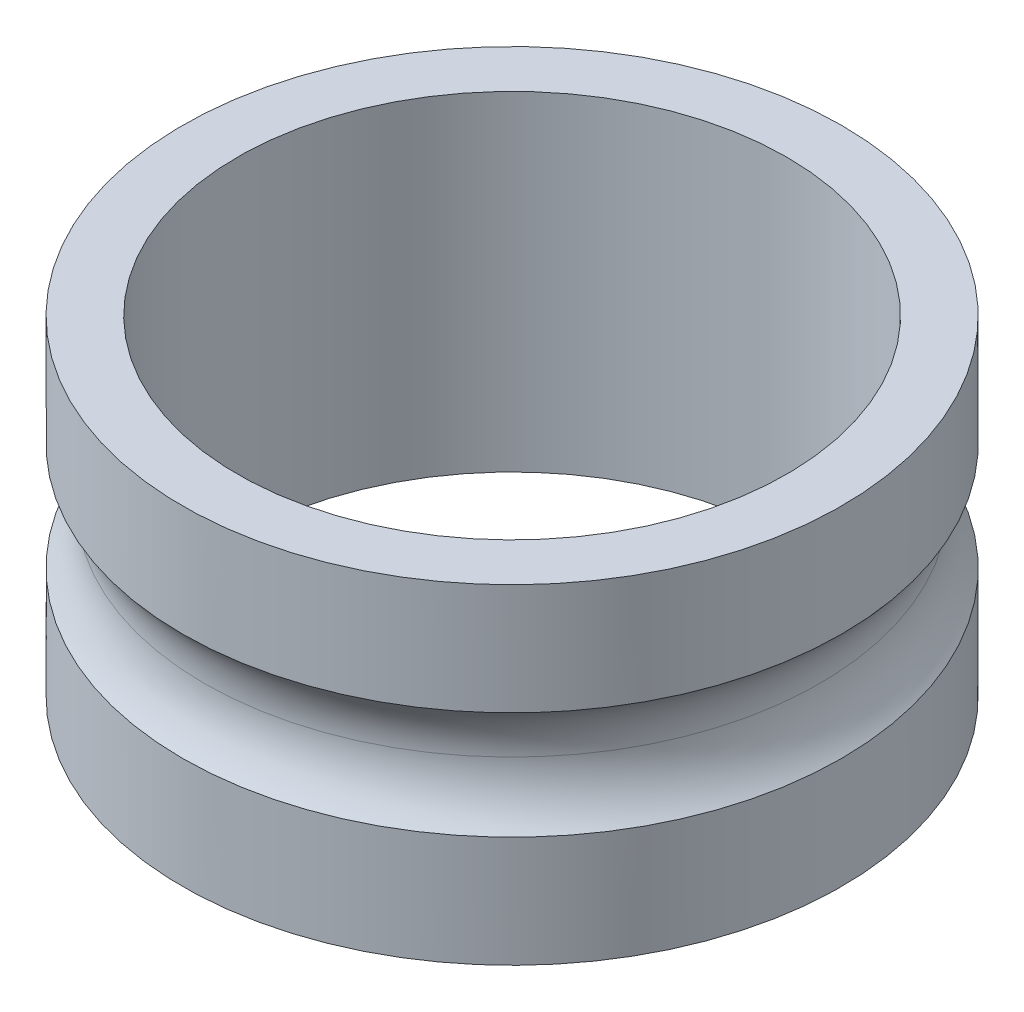
ISO-10303-21;
HEADER;
FILE_DESCRIPTION(('STEP AP214'),'2;1');
FILE_NAME('part.step','',(''),(''),'','','');
FILE_SCHEMA(('AUTOMOTIVE_DESIGN { 1 0 10303 214 1 1 1 1 }'));
ENDSEC;
DATA;
#1=APPLICATION_CONTEXT('core data for automotive mechanical design processes');
#2=APPLICATION_PROTOCOL_DEFINITION('international standard','automotive_design',2000,#1);
#3=PRODUCT_CONTEXT('',#1,'mechanical');
#4=PRODUCT('Part','Part','',(#3));
#5=PRODUCT_RELATED_PRODUCT_CATEGORY('part','',(#4));
#6=PRODUCT_DEFINITION_FORMATION('','',#4);
#7=PRODUCT_DEFINITION_CONTEXT('part definition',#1,'design');
#8=PRODUCT_DEFINITION('design','',#6,#7);
#9=PRODUCT_DEFINITION_SHAPE('','',#8);
#10=(LENGTH_UNIT() NAMED_UNIT(*) SI_UNIT(.MILLI.,.METRE.));
#11=(NAMED_UNIT(*) PLANE_ANGLE_UNIT() SI_UNIT($,.RADIAN.));
#12=(NAMED_UNIT(*) SI_UNIT($,.STERADIAN.) SOLID_ANGLE_UNIT());
#13=UNCERTAINTY_MEASURE_WITH_UNIT(LENGTH_MEASURE(1.E-05),#10,'distance_accuracy_value','');
#14=(GEOMETRIC_REPRESENTATION_CONTEXT(3) GLOBAL_UNCERTAINTY_ASSIGNED_CONTEXT((#13)) GLOBAL_UNIT_ASSIGNED_CONTEXT((#10,
#11,#12)) REPRESENTATION_CONTEXT('',''));
#15=CARTESIAN_POINT('',(0.,0.,0.));
#16=DIRECTION('',(0.,0.,1.));
#17=DIRECTION('',(1.,0.,0.));
#18=AXIS2_PLACEMENT_3D('',#15,#16,#17);
#19=CARTESIAN_POINT('',(0.,-1.5,0.));
#20=DIRECTION('',(0.,1.,0.));
#21=DIRECTION('',(1.,0.,0.));
#22=AXIS2_PLACEMENT_3D('',#19,#20,#21);
#23=PLANE('',#22);
#24=CARTESIAN_POINT('',(0.,-1.5,0.));
#25=DIRECTION('',(0.,1.,0.));
#26=DIRECTION('',(0.,0.,-1.));
#27=AXIS2_PLACEMENT_3D('',#24,#25,#26);
#28=CIRCLE('',#27,2.5);
#29=CARTESIAN_POINT('',(0.,-1.5,-2.5));
#30=VERTEX_POINT('',#29);
#31=EDGE_CURVE('E100',#30,#30,#28,.T.);
#32=ORIENTED_EDGE('',*,*,#31,.T.);
#33=EDGE_LOOP('',(#32));
#34=FACE_BOUND('',#33,.T.);
#35=CARTESIAN_POINT('',(0.,-1.5,0.));
#36=DIRECTION('',(0.,1.,0.));
#37=DIRECTION('',(0.,0.,1.));
#38=AXIS2_PLACEMENT_3D('',#35,#36,#37);
#39=CIRCLE('',#38,3.);
#40=CARTESIAN_POINT('',(0.,-1.5,-3.));
#41=VERTEX_POINT('',#40);
#42=EDGE_CURVE('E26',#41,#41,#39,.T.);
#43=ORIENTED_EDGE('',*,*,#42,.F.);
#44=EDGE_LOOP('',(#43));
#45=FACE_BOUND('',#44,.T.);
#46=ADVANCED_FACE('F16',(#34,#45),#23,.F.);
#47=CARTESIAN_POINT('',(0.,1.5,0.));
#48=DIRECTION('',(0.,1.,0.));
#49=DIRECTION('',(1.,0.,0.));
#50=AXIS2_PLACEMENT_3D('',#47,#48,#49);
#51=PLANE('',#50);
#52=CARTESIAN_POINT('',(0.,1.5,0.));
#53=DIRECTION('',(0.,1.,0.));
#54=DIRECTION('',(0.,0.,-1.));
#55=AXIS2_PLACEMENT_3D('',#52,#53,#54);
#56=CIRCLE('',#55,2.5);
#57=CARTESIAN_POINT('',(0.,1.5,-2.5));
#58=VERTEX_POINT('',#57);
#59=EDGE_CURVE('E97',#58,#58,#56,.T.);
#60=ORIENTED_EDGE('',*,*,#59,.F.);
#61=EDGE_LOOP('',(#60));
#62=FACE_BOUND('',#61,.T.);
#63=CARTESIAN_POINT('',(0.,1.5,0.));
#64=DIRECTION('',(0.,1.,0.));
#65=DIRECTION('',(0.,0.,1.));
#66=AXIS2_PLACEMENT_3D('',#63,#64,#65);
#67=CIRCLE('',#66,3.);
#68=CARTESIAN_POINT('',(0.,1.5,-3.));
#69=VERTEX_POINT('',#68);
#70=EDGE_CURVE('E11',#69,#69,#67,.T.);
#71=ORIENTED_EDGE('',*,*,#70,.T.);
#72=EDGE_LOOP('',(#71));
#73=FACE_BOUND('',#72,.T.);
#74=ADVANCED_FACE('F163',(#62,#73),#51,.T.);
#75=CARTESIAN_POINT('',(0.,1.5,0.));
#76=DIRECTION('',(0.,-1.,0.));
#77=DIRECTION('',(0.,0.,-1.));
#78=AXIS2_PLACEMENT_3D('',#75,#76,#77);
#79=CYLINDRICAL_SURFACE('',#78,3.);
#80=CARTESIAN_POINT('',(0.,0.489897948556636,0.));
#81=DIRECTION('',(0.,-1.,0.));
#82=DIRECTION('',(0.,0.,-1.));
#83=AXIS2_PLACEMENT_3D('',#80,#81,#82);
#84=CIRCLE('',#83,3.);
#85=CARTESIAN_POINT('',(0.,0.489897948556636,-3.));
#86=VERTEX_POINT('',#85);
#87=CARTESIAN_POINT('',(0.,0.489897948556636,3.));
#88=VERTEX_POINT('',#87);
#89=EDGE_CURVE('E78',#86,#88,#84,.T.);
#90=ORIENTED_EDGE('',*,*,#89,.F.);
#91=CARTESIAN_POINT('',(0.,0.489897948556636,0.));
#92=DIRECTION('',(0.,-1.,0.));
#93=DIRECTION('',(0.,0.,1.));
#94=AXIS2_PLACEMENT_3D('',#91,#92,#93);
#95=CIRCLE('',#94,3.);
#96=EDGE_CURVE('E81',#88,#86,#95,.T.);
#97=ORIENTED_EDGE('',*,*,#96,.F.);
#98=EDGE_LOOP('',(#90,#97));
#99=FACE_BOUND('',#98,.T.);
#100=ORIENTED_EDGE('',*,*,#70,.F.);
#101=EDGE_LOOP('',(#100));
#102=FACE_BOUND('',#101,.T.);
#103=ADVANCED_FACE('F85',(#99,#102),#79,.T.);
#104=CARTESIAN_POINT('',(0.,1.5,0.));
#105=DIRECTION('',(0.,-1.,0.));
#106=DIRECTION('',(0.,0.,-1.));
#107=AXIS2_PLACEMENT_3D('',#104,#105,#106);
#108=CYLINDRICAL_SURFACE('',#107,3.);
#109=CARTESIAN_POINT('',(0.,-0.489897948556636,0.));
#110=DIRECTION('',(0.,1.,0.));
#111=DIRECTION('',(0.,0.,-1.));
#112=AXIS2_PLACEMENT_3D('',#109,#110,#111);
#113=CIRCLE('',#112,3.);
#114=CARTESIAN_POINT('',(0.,-0.489897948556636,-3.));
#115=VERTEX_POINT('',#114);
#116=CARTESIAN_POINT('',(0.,-0.489897948556636,3.));
#117=VERTEX_POINT('',#116);
#118=EDGE_CURVE('E104',#115,#117,#113,.T.);
#119=ORIENTED_EDGE('',*,*,#118,.F.);
#120=CARTESIAN_POINT('',(0.,-0.489897948556636,0.));
#121=DIRECTION('',(0.,1.,0.));
#122=DIRECTION('',(0.,0.,1.));
#123=AXIS2_PLACEMENT_3D('',#120,#121,#122);
#124=CIRCLE('',#123,3.);
#125=EDGE_CURVE('E94',#117,#115,#124,.T.);
#126=ORIENTED_EDGE('',*,*,#125,.F.);
#127=EDGE_LOOP('',(#119,#126));
#128=FACE_BOUND('',#127,.T.);
#129=ORIENTED_EDGE('',*,*,#42,.T.);
#130=EDGE_LOOP('',(#129));
#131=FACE_BOUND('',#130,.T.);
#132=ADVANCED_FACE('F18',(#128,#131),#108,.T.);
#133=CARTESIAN_POINT('',(0.,1.5,0.));
#134=DIRECTION('',(0.,-1.,0.));
#135=DIRECTION('',(0.,0.,-1.));
#136=AXIS2_PLACEMENT_3D('',#133,#134,#135);
#137=CYLINDRICAL_SURFACE('',#136,2.5);
#138=ORIENTED_EDGE('',*,*,#59,.T.);
#139=EDGE_LOOP('',(#138));
#140=FACE_BOUND('',#139,.T.);
#141=ORIENTED_EDGE('',*,*,#31,.F.);
#142=EDGE_LOOP('',(#141));
#143=FACE_BOUND('',#142,.T.);
#144=ADVANCED_FACE('F147',(#140,#143),#137,.F.);
#145=CARTESIAN_POINT('',(0.,0.,0.));
#146=DIRECTION('',(0.,1.,0.));
#147=DIRECTION('',(0.,0.,1.));
#148=AXIS2_PLACEMENT_3D('',#145,#146,#147);
#149=TOROIDAL_SURFACE('',#148,3.5,0.7);
#150=ORIENTED_EDGE('',*,*,#125,.T.);
#151=ORIENTED_EDGE('',*,*,#118,.T.);
#152=EDGE_LOOP('',(#150,#151));
#153=FACE_BOUND('',#152,.T.);
#154=CARTESIAN_POINT('',(0.,0.,0.));
#155=DIRECTION('',(0.,1.,0.));
#156=DIRECTION('',(0.,0.,-1.));
#157=AXIS2_PLACEMENT_3D('',#154,#155,#156);
#158=CIRCLE('',#157,2.8);
#159=CARTESIAN_POINT('',(0.,0.,-2.8));
#160=VERTEX_POINT('',#159);
#161=CARTESIAN_POINT('',(0.,0.,2.8));
#162=VERTEX_POINT('',#161);
#163=EDGE_CURVE('E59',#160,#162,#158,.T.);
#164=ORIENTED_EDGE('',*,*,#163,.F.);
#165=CARTESIAN_POINT('',(0.,0.,0.));
#166=DIRECTION('',(0.,1.,0.));
#167=DIRECTION('',(0.,0.,1.));
#168=AXIS2_PLACEMENT_3D('',#165,#166,#167);
#169=CIRCLE('',#168,2.8);
#170=EDGE_CURVE('E20',#162,#160,#169,.T.);
#171=ORIENTED_EDGE('',*,*,#170,.F.);
#172=EDGE_LOOP('',(#164,#171));
#173=FACE_BOUND('',#172,.T.);
#174=ADVANCED_FACE('F142',(#153,#173),#149,.F.);
#175=CARTESIAN_POINT('',(0.,0.,0.));
#176=DIRECTION('',(0.,1.,0.));
#177=DIRECTION('',(0.,0.,1.));
#178=AXIS2_PLACEMENT_3D('',#175,#176,#177);
#179=TOROIDAL_SURFACE('',#178,3.5,0.7);
#180=ORIENTED_EDGE('',*,*,#170,.T.);
#181=ORIENTED_EDGE('',*,*,#163,.T.);
#182=EDGE_LOOP('',(#180,#181));
#183=FACE_BOUND('',#182,.T.);
#184=ORIENTED_EDGE('',*,*,#96,.T.);
#185=ORIENTED_EDGE('',*,*,#89,.T.);
#186=EDGE_LOOP('',(#184,#185));
#187=FACE_BOUND('',#186,.T.);
#188=ADVANCED_FACE('F80',(#183,#187),#179,.F.);
#189=CLOSED_SHELL('',(#46,#74,#103,#132,#144,#174,#188));
#190=MANIFOLD_SOLID_BREP('B1',#189);
#191=ADVANCED_BREP_SHAPE_REPRESENTATION('',(#18,#190),#14);
#192=SHAPE_DEFINITION_REPRESENTATION(#9,#191);
ENDSEC;
END-ISO-10303-21;
